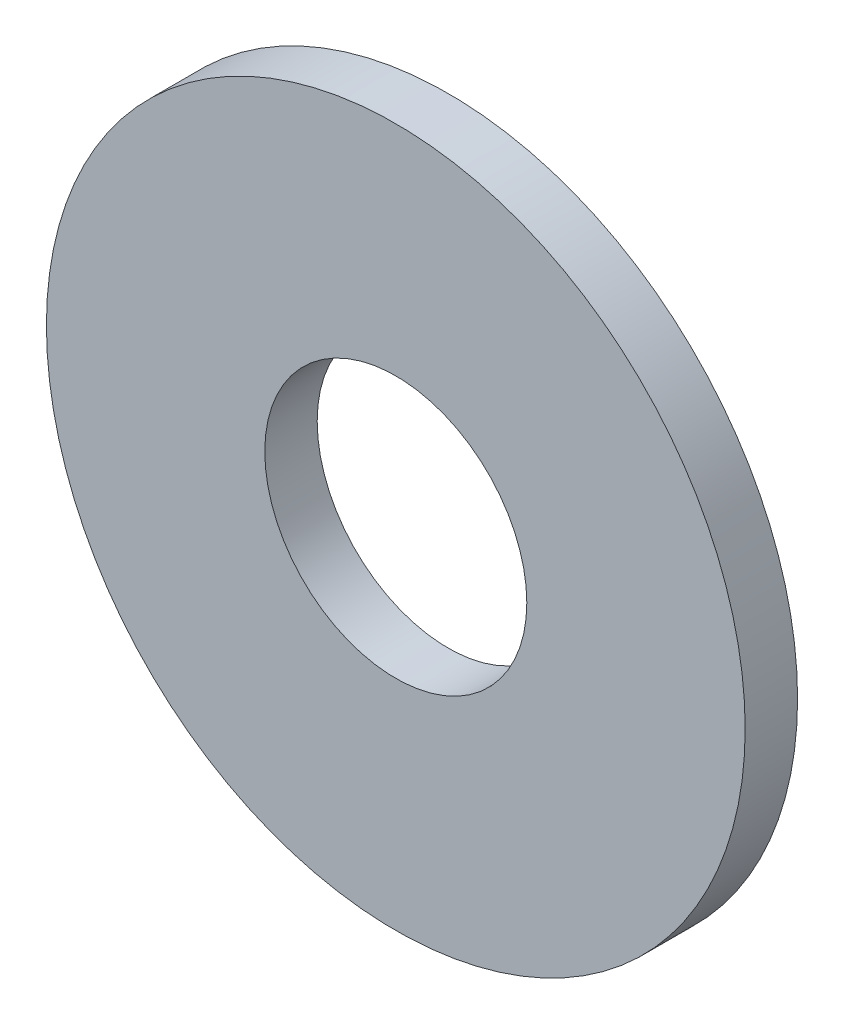
ISO-10303-21;
HEADER;
FILE_DESCRIPTION(('STEP AP214'),'2;1');
FILE_NAME('part.step','',(''),(''),'','','');
FILE_SCHEMA(('AUTOMOTIVE_DESIGN { 1 0 10303 214 1 1 1 1 }'));
ENDSEC;
DATA;
#1=APPLICATION_CONTEXT('core data for automotive mechanical design processes');
#2=APPLICATION_PROTOCOL_DEFINITION('international standard','automotive_design',2000,#1);
#3=PRODUCT_CONTEXT('',#1,'mechanical');
#4=PRODUCT('Part','Part','',(#3));
#5=PRODUCT_RELATED_PRODUCT_CATEGORY('part','',(#4));
#6=PRODUCT_DEFINITION_FORMATION('','',#4);
#7=PRODUCT_DEFINITION_CONTEXT('part definition',#1,'design');
#8=PRODUCT_DEFINITION('design','',#6,#7);
#9=PRODUCT_DEFINITION_SHAPE('','',#8);
#10=(LENGTH_UNIT() NAMED_UNIT(*) SI_UNIT(.MILLI.,.METRE.));
#11=(NAMED_UNIT(*) PLANE_ANGLE_UNIT() SI_UNIT($,.RADIAN.));
#12=(NAMED_UNIT(*) SI_UNIT($,.STERADIAN.) SOLID_ANGLE_UNIT());
#13=UNCERTAINTY_MEASURE_WITH_UNIT(LENGTH_MEASURE(1.E-05),#10,'distance_accuracy_value','');
#14=(GEOMETRIC_REPRESENTATION_CONTEXT(3) GLOBAL_UNCERTAINTY_ASSIGNED_CONTEXT((#13)) GLOBAL_UNIT_ASSIGNED_CONTEXT((#10,
#11,#12)) REPRESENTATION_CONTEXT('',''));
#15=CARTESIAN_POINT('',(0.,0.,0.));
#16=DIRECTION('',(0.,0.,1.));
#17=DIRECTION('',(1.,0.,0.));
#18=AXIS2_PLACEMENT_3D('',#15,#16,#17);
#19=CARTESIAN_POINT('',(0.,0.,1.2));
#20=DIRECTION('',(0.,0.,1.));
#21=DIRECTION('',(1.,0.,0.));
#22=AXIS2_PLACEMENT_3D('',#19,#20,#21);
#23=PLANE('',#22);
#24=CARTESIAN_POINT('',(0.,0.,1.2));
#25=DIRECTION('',(0.,0.,1.));
#26=DIRECTION('',(1.,0.,0.));
#27=AXIS2_PLACEMENT_3D('',#24,#25,#26);
#28=CIRCLE('',#27,8.);
#29=CARTESIAN_POINT('',(8.,0.,1.2));
#30=VERTEX_POINT('',#29);
#31=EDGE_CURVE('E10',#30,#30,#28,.T.);
#32=ORIENTED_EDGE('',*,*,#31,.T.);
#33=EDGE_LOOP('',(#32));
#34=FACE_BOUND('',#33,.T.);
#35=CARTESIAN_POINT('',(0.,0.,1.2));
#36=DIRECTION('',(0.,0.,1.));
#37=DIRECTION('',(1.,0.,0.));
#38=AXIS2_PLACEMENT_3D('',#35,#36,#37);
#39=CIRCLE('',#38,3.);
#40=CARTESIAN_POINT('',(3.,0.,1.2));
#41=VERTEX_POINT('',#40);
#42=EDGE_CURVE('E46',#41,#41,#39,.T.);
#43=ORIENTED_EDGE('',*,*,#42,.F.);
#44=EDGE_LOOP('',(#43));
#45=FACE_BOUND('',#44,.T.);
#46=ADVANCED_FACE('F35',(#34,#45),#23,.T.);
#47=CARTESIAN_POINT('',(0.,0.,0.));
#48=DIRECTION('',(0.,0.,1.));
#49=DIRECTION('',(1.,0.,0.));
#50=AXIS2_PLACEMENT_3D('',#47,#48,#49);
#51=PLANE('',#50);
#52=CARTESIAN_POINT('',(0.,0.,0.));
#53=DIRECTION('',(0.,0.,1.));
#54=DIRECTION('',(1.,0.,0.));
#55=AXIS2_PLACEMENT_3D('',#52,#53,#54);
#56=CIRCLE('',#55,8.);
#57=CARTESIAN_POINT('',(8.,0.,0.));
#58=VERTEX_POINT('',#57);
#59=EDGE_CURVE('E39',#58,#58,#56,.T.);
#60=ORIENTED_EDGE('',*,*,#59,.F.);
#61=EDGE_LOOP('',(#60));
#62=FACE_BOUND('',#61,.T.);
#63=CARTESIAN_POINT('',(0.,0.,0.));
#64=DIRECTION('',(0.,0.,1.));
#65=DIRECTION('',(1.,0.,0.));
#66=AXIS2_PLACEMENT_3D('',#63,#64,#65);
#67=CIRCLE('',#66,3.);
#68=CARTESIAN_POINT('',(3.,0.,0.));
#69=VERTEX_POINT('',#68);
#70=EDGE_CURVE('E48',#69,#69,#67,.T.);
#71=ORIENTED_EDGE('',*,*,#70,.T.);
#72=EDGE_LOOP('',(#71));
#73=FACE_BOUND('',#72,.T.);
#74=ADVANCED_FACE('F58',(#62,#73),#51,.F.);
#75=CARTESIAN_POINT('',(0.,0.,1.2));
#76=DIRECTION('',(0.,0.,-1.));
#77=DIRECTION('',(-1.,0.,0.));
#78=AXIS2_PLACEMENT_3D('',#75,#76,#77);
#79=CYLINDRICAL_SURFACE('',#78,8.);
#80=ORIENTED_EDGE('',*,*,#31,.F.);
#81=EDGE_LOOP('',(#80));
#82=FACE_BOUND('',#81,.T.);
#83=ORIENTED_EDGE('',*,*,#59,.T.);
#84=EDGE_LOOP('',(#83));
#85=FACE_BOUND('',#84,.T.);
#86=ADVANCED_FACE('F37',(#82,#85),#79,.T.);
#87=CARTESIAN_POINT('',(0.,0.,1.2));
#88=DIRECTION('',(0.,0.,-1.));
#89=DIRECTION('',(-1.,0.,0.));
#90=AXIS2_PLACEMENT_3D('',#87,#88,#89);
#91=CYLINDRICAL_SURFACE('',#90,3.);
#92=ORIENTED_EDGE('',*,*,#42,.T.);
#93=EDGE_LOOP('',(#92));
#94=FACE_BOUND('',#93,.T.);
#95=ORIENTED_EDGE('',*,*,#70,.F.);
#96=EDGE_LOOP('',(#95));
#97=FACE_BOUND('',#96,.T.);
#98=ADVANCED_FACE('F54',(#94,#97),#91,.F.);
#99=CLOSED_SHELL('',(#46,#74,#86,#98));
#100=MANIFOLD_SOLID_BREP('B2',#99);
#101=ADVANCED_BREP_SHAPE_REPRESENTATION('',(#18,#100),#14);
#102=SHAPE_DEFINITION_REPRESENTATION(#9,#101);
ENDSEC;
END-ISO-10303-21;
